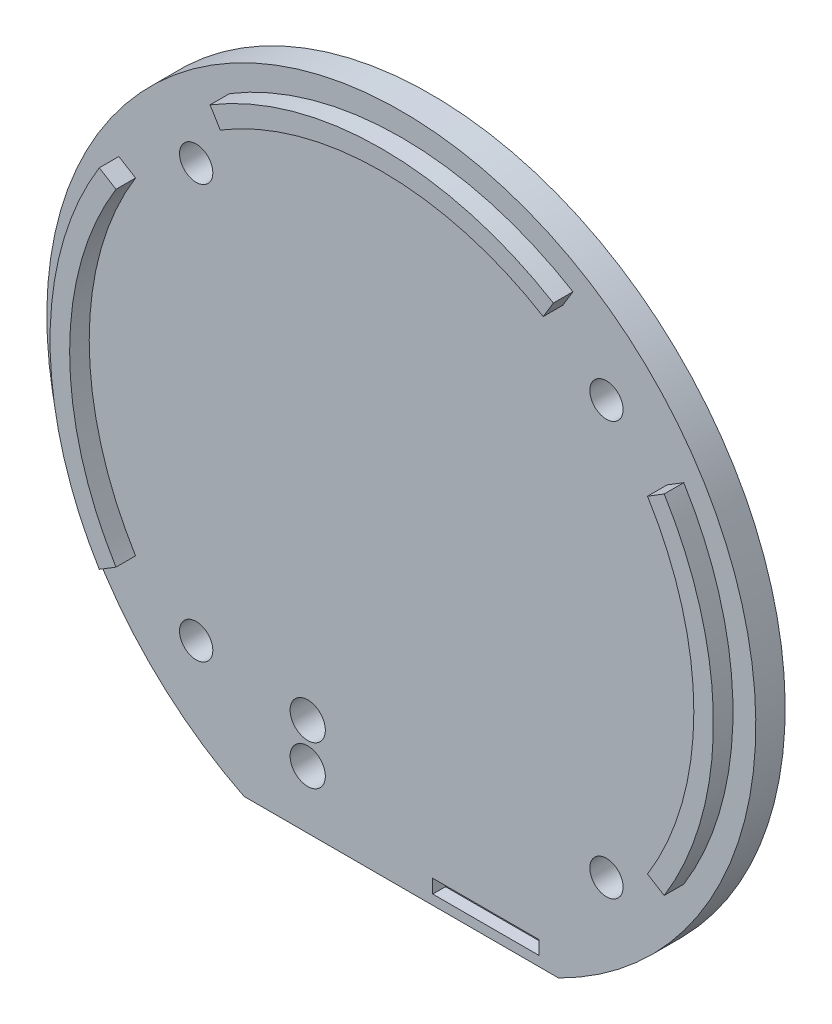
ISO-10303-21;
HEADER;
FILE_DESCRIPTION(('STEP AP214'),'2;1');
FILE_NAME('part.step','',(''),(''),'','','');
FILE_SCHEMA(('AUTOMOTIVE_DESIGN { 1 0 10303 214 1 1 1 1 }'));
ENDSEC;
DATA;
#1=APPLICATION_CONTEXT('core data for automotive mechanical design processes');
#2=APPLICATION_PROTOCOL_DEFINITION('international standard','automotive_design',2000,#1);
#3=PRODUCT_CONTEXT('',#1,'mechanical');
#4=PRODUCT('Part','Part','',(#3));
#5=PRODUCT_RELATED_PRODUCT_CATEGORY('part','',(#4));
#6=PRODUCT_DEFINITION_FORMATION('','',#4);
#7=PRODUCT_DEFINITION_CONTEXT('part definition',#1,'design');
#8=PRODUCT_DEFINITION('design','',#6,#7);
#9=PRODUCT_DEFINITION_SHAPE('','',#8);
#10=(LENGTH_UNIT() NAMED_UNIT(*) SI_UNIT(.MILLI.,.METRE.));
#11=(NAMED_UNIT(*) PLANE_ANGLE_UNIT() SI_UNIT($,.RADIAN.));
#12=(NAMED_UNIT(*) SI_UNIT($,.STERADIAN.) SOLID_ANGLE_UNIT());
#13=UNCERTAINTY_MEASURE_WITH_UNIT(LENGTH_MEASURE(1.E-05),#10,'distance_accuracy_value','');
#14=(GEOMETRIC_REPRESENTATION_CONTEXT(3) GLOBAL_UNCERTAINTY_ASSIGNED_CONTEXT((#13)) GLOBAL_UNIT_ASSIGNED_CONTEXT((#10,
#11,#12)) REPRESENTATION_CONTEXT('',''));
#15=CARTESIAN_POINT('',(0.,0.,0.));
#16=DIRECTION('',(0.,0.,1.));
#17=DIRECTION('',(1.,0.,0.));
#18=AXIS2_PLACEMENT_3D('',#15,#16,#17);
#19=CARTESIAN_POINT('',(0.,0.,3.));
#20=DIRECTION('',(0.,0.,1.));
#21=DIRECTION('',(1.,0.,0.));
#22=AXIS2_PLACEMENT_3D('',#19,#20,#21);
#23=PLANE('',#22);
#24=DIRECTION('',(0.,-1.,0.));
#25=VECTOR('',#24,1.);
#26=CARTESIAN_POINT('',(3.20999999999999,-31.4536669730864,3.));
#27=LINE('',#26,#25);
#28=CARTESIAN_POINT('',(3.20999999999999,-30.0536669730864,3.));
#29=VERTEX_POINT('',#28);
#30=CARTESIAN_POINT('',(3.20999999999999,-31.4536669730864,3.));
#31=VERTEX_POINT('',#30);
#32=EDGE_CURVE('E48',#29,#31,#27,.T.);
#33=ORIENTED_EDGE('',*,*,#32,.F.);
#34=DIRECTION('',(-1.,0.,0.));
#35=VECTOR('',#34,1.);
#36=CARTESIAN_POINT('',(3.20999999999999,-30.0536669730864,3.));
#37=LINE('',#36,#35);
#38=CARTESIAN_POINT('',(14.06,-30.0536669730864,3.));
#39=VERTEX_POINT('',#38);
#40=EDGE_CURVE('E179',#39,#29,#37,.T.);
#41=ORIENTED_EDGE('',*,*,#40,.F.);
#42=DIRECTION('',(0.,1.,0.));
#43=VECTOR('',#42,1.);
#44=CARTESIAN_POINT('',(14.06,-31.4536669730864,3.));
#45=LINE('',#44,#43);
#46=CARTESIAN_POINT('',(14.06,-31.4536669730864,3.));
#47=VERTEX_POINT('',#46);
#48=EDGE_CURVE('E182',#47,#39,#45,.T.);
#49=ORIENTED_EDGE('',*,*,#48,.F.);
#50=DIRECTION('',(1.,0.,0.));
#51=VECTOR('',#50,1.);
#52=CARTESIAN_POINT('',(3.20999999999999,-31.4536669730864,3.));
#53=LINE('',#52,#51);
#54=EDGE_CURVE('E188',#31,#47,#53,.T.);
#55=ORIENTED_EDGE('',*,*,#54,.F.);
#56=EDGE_LOOP('',(#33,#41,#49,#55));
#57=FACE_BOUND('',#56,.T.);
#58=CARTESIAN_POINT('',(-9.56,-22.4536669730864,3.));
#59=DIRECTION('',(0.,0.,1.));
#60=DIRECTION('',(1.,0.,0.));
#61=AXIS2_PLACEMENT_3D('',#58,#59,#60);
#62=CIRCLE('',#61,1.8);
#63=CARTESIAN_POINT('',(-7.76,-22.4536669730864,3.));
#64=VERTEX_POINT('',#63);
#65=EDGE_CURVE('E201',#64,#64,#62,.F.);
#66=ORIENTED_EDGE('',*,*,#65,.T.);
#67=EDGE_LOOP('',(#66));
#68=FACE_BOUND('',#67,.T.);
#69=CARTESIAN_POINT('',(-9.56,-26.5236669730864,3.));
#70=DIRECTION('',(0.,0.,1.));
#71=DIRECTION('',(1.,0.,0.));
#72=AXIS2_PLACEMENT_3D('',#69,#70,#71);
#73=CIRCLE('',#72,1.8);
#74=CARTESIAN_POINT('',(-7.76,-26.5236669730864,3.));
#75=VERTEX_POINT('',#74);
#76=EDGE_CURVE('E202',#75,#75,#73,.F.);
#77=ORIENTED_EDGE('',*,*,#76,.T.);
#78=EDGE_LOOP('',(#77));
#79=FACE_BOUND('',#78,.T.);
#80=CARTESIAN_POINT('',(20.955,21.12,3.));
#81=DIRECTION('',(0.,0.,1.));
#82=DIRECTION('',(-1.,0.,0.));
#83=AXIS2_PLACEMENT_3D('',#80,#81,#82);
#84=CIRCLE('',#83,1.69999999999999);
#85=CARTESIAN_POINT('',(19.255,21.12,3.));
#86=VERTEX_POINT('',#85);
#87=EDGE_CURVE('E301',#86,#86,#84,.T.);
#88=ORIENTED_EDGE('',*,*,#87,.F.);
#89=EDGE_LOOP('',(#88));
#90=FACE_BOUND('',#89,.T.);
#91=CARTESIAN_POINT('',(-20.955,-21.12,3.));
#92=DIRECTION('',(0.,0.,1.));
#93=DIRECTION('',(1.,0.,0.));
#94=AXIS2_PLACEMENT_3D('',#91,#92,#93);
#95=CIRCLE('',#94,1.7);
#96=CARTESIAN_POINT('',(-19.255,-21.12,3.));
#97=VERTEX_POINT('',#96);
#98=EDGE_CURVE('E300',#97,#97,#95,.T.);
#99=ORIENTED_EDGE('',*,*,#98,.F.);
#100=EDGE_LOOP('',(#99));
#101=FACE_BOUND('',#100,.T.);
#102=CARTESIAN_POINT('',(20.955,-21.12,3.));
#103=DIRECTION('',(0.,0.,1.));
#104=DIRECTION('',(-1.,0.,0.));
#105=AXIS2_PLACEMENT_3D('',#102,#103,#104);
#106=CIRCLE('',#105,1.7);
#107=CARTESIAN_POINT('',(19.255,-21.12,3.));
#108=VERTEX_POINT('',#107);
#109=EDGE_CURVE('E294',#108,#108,#106,.T.);
#110=ORIENTED_EDGE('',*,*,#109,.F.);
#111=EDGE_LOOP('',(#110));
#112=FACE_BOUND('',#111,.T.);
#113=CARTESIAN_POINT('',(-20.955,21.12,3.));
#114=DIRECTION('',(0.,0.,1.));
#115=DIRECTION('',(1.,0.,0.));
#116=AXIS2_PLACEMENT_3D('',#113,#114,#115);
#117=CIRCLE('',#116,1.7);
#118=CARTESIAN_POINT('',(-19.255,21.12,3.));
#119=VERTEX_POINT('',#118);
#120=EDGE_CURVE('E308',#119,#119,#117,.T.);
#121=ORIENTED_EDGE('',*,*,#120,.F.);
#122=EDGE_LOOP('',(#121));
#123=FACE_BOUND('',#122,.T.);
#124=CARTESIAN_POINT('',(0.,0.,3.));
#125=DIRECTION('',(0.,0.,1.));
#126=DIRECTION('',(1.,0.,0.));
#127=AXIS2_PLACEMENT_3D('',#124,#125,#126);
#128=CIRCLE('',#127,36.21);
#129=CARTESIAN_POINT('',(16.06,-32.4536669730864,3.));
#130=VERTEX_POINT('',#129);
#131=CARTESIAN_POINT('',(-16.06,-32.4536669730864,3.));
#132=VERTEX_POINT('',#131);
#133=EDGE_CURVE('E319',#130,#132,#128,.T.);
#134=ORIENTED_EDGE('',*,*,#133,.T.);
#135=DIRECTION('',(1.,0.,0.));
#136=VECTOR('',#135,1.);
#137=CARTESIAN_POINT('',(-16.06,-32.4536669730864,3.));
#138=LINE('',#137,#136);
#139=EDGE_CURVE('E322',#132,#130,#138,.T.);
#140=ORIENTED_EDGE('',*,*,#139,.T.);
#141=EDGE_LOOP('',(#134,#140));
#142=FACE_BOUND('',#141,.T.);
#143=DIRECTION('',(0.851575618923762,0.52423178581102,0.));
#144=VECTOR('',#143,1.);
#145=CARTESIAN_POINT('',(-28.8513819691372,-17.7609729032773,3.));
#146=LINE('',#145,#144);
#147=CARTESIAN_POINT('',(-28.8513819691372,-17.7609729032773,3.));
#148=VERTEX_POINT('',#147);
#149=CARTESIAN_POINT('',(-27.1482307312897,-16.7125093316553,3.));
#150=VERTEX_POINT('',#149);
#151=EDGE_CURVE('E279',#148,#150,#146,.T.);
#152=ORIENTED_EDGE('',*,*,#151,.F.);
#153=CARTESIAN_POINT('',(0.,0.,3.));
#154=DIRECTION('',(0.,0.,1.));
#155=DIRECTION('',(1.,0.,0.));
#156=AXIS2_PLACEMENT_3D('',#153,#154,#155);
#157=CIRCLE('',#156,33.8800000000001);
#158=CARTESIAN_POINT('',(-28.8513819691372,17.7609729032773,3.));
#159=VERTEX_POINT('',#158);
#160=EDGE_CURVE('E265',#159,#148,#157,.T.);
#161=ORIENTED_EDGE('',*,*,#160,.F.);
#162=DIRECTION('',(-0.851575618923764,0.524231785811017,0.));
#163=VECTOR('',#162,1.);
#164=CARTESIAN_POINT('',(-28.8513819691372,17.7609729032773,3.));
#165=LINE('',#164,#163);
#166=CARTESIAN_POINT('',(-27.1482307312897,16.7125093316552,3.));
#167=VERTEX_POINT('',#166);
#168=EDGE_CURVE('E270',#167,#159,#165,.T.);
#169=ORIENTED_EDGE('',*,*,#168,.F.);
#170=CARTESIAN_POINT('',(0.,0.,3.));
#171=DIRECTION('',(0.,0.,-1.));
#172=DIRECTION('',(1.,0.,0.));
#173=AXIS2_PLACEMENT_3D('',#170,#171,#172);
#174=CIRCLE('',#173,31.8800000000001);
#175=EDGE_CURVE('E281',#150,#167,#174,.T.);
#176=ORIENTED_EDGE('',*,*,#175,.F.);
#177=EDGE_LOOP('',(#152,#161,#169,#176));
#178=FACE_BOUND('',#177,.T.);
#179=DIRECTION('',(0.517536740302721,-0.855660985692835,0.));
#180=VECTOR('',#179,1.);
#181=CARTESIAN_POINT('',(-17.5341447614561,28.9897941952734,3.));
#182=LINE('',#181,#180);
#183=CARTESIAN_POINT('',(-17.5341447614561,28.9897941952734,3.));
#184=VERTEX_POINT('',#183);
#185=CARTESIAN_POINT('',(-16.4990712808507,27.2784722238877,3.));
#186=VERTEX_POINT('',#185);
#187=EDGE_CURVE('E250',#184,#186,#182,.T.);
#188=ORIENTED_EDGE('',*,*,#187,.F.);
#189=CARTESIAN_POINT('',(0.,0.,3.));
#190=DIRECTION('',(0.,0.,1.));
#191=DIRECTION('',(1.,0.,0.));
#192=AXIS2_PLACEMENT_3D('',#189,#190,#191);
#193=CIRCLE('',#192,33.8800000000001);
#194=CARTESIAN_POINT('',(17.5341447614561,28.9897941952734,3.));
#195=VERTEX_POINT('',#194);
#196=EDGE_CURVE('E236',#195,#184,#193,.T.);
#197=ORIENTED_EDGE('',*,*,#196,.F.);
#198=DIRECTION('',(0.517536740302719,0.855660985692836,0.));
#199=VECTOR('',#198,1.);
#200=CARTESIAN_POINT('',(17.5341447614561,28.9897941952734,3.));
#201=LINE('',#200,#199);
#202=CARTESIAN_POINT('',(16.4990712808508,27.2784722238877,3.));
#203=VERTEX_POINT('',#202);
#204=EDGE_CURVE('E241',#203,#195,#201,.T.);
#205=ORIENTED_EDGE('',*,*,#204,.F.);
#206=CARTESIAN_POINT('',(0.,0.,3.));
#207=DIRECTION('',(0.,0.,-1.));
#208=DIRECTION('',(1.,0.,0.));
#209=AXIS2_PLACEMENT_3D('',#206,#207,#208);
#210=CIRCLE('',#209,31.8800000000001);
#211=EDGE_CURVE('E252',#186,#203,#210,.T.);
#212=ORIENTED_EDGE('',*,*,#211,.F.);
#213=EDGE_LOOP('',(#188,#197,#205,#212));
#214=FACE_BOUND('',#213,.T.);
#215=DIRECTION('',(-0.851575618923764,-0.524231785811017,0.));
#216=VECTOR('',#215,1.);
#217=CARTESIAN_POINT('',(28.8513819691372,17.7609729032773,3.));
#218=LINE('',#217,#216);
#219=CARTESIAN_POINT('',(28.8513819691372,17.7609729032773,3.));
#220=VERTEX_POINT('',#219);
#221=CARTESIAN_POINT('',(27.1482307312896,16.7125093316553,3.));
#222=VERTEX_POINT('',#221);
#223=EDGE_CURVE('E223',#220,#222,#218,.T.);
#224=ORIENTED_EDGE('',*,*,#223,.F.);
#225=CARTESIAN_POINT('',(0.,0.,3.));
#226=DIRECTION('',(0.,0.,1.));
#227=DIRECTION('',(-1.,0.,0.));
#228=AXIS2_PLACEMENT_3D('',#225,#226,#227);
#229=CIRCLE('',#228,33.8800000000001);
#230=CARTESIAN_POINT('',(28.8513819691372,-17.7609729032773,3.));
#231=VERTEX_POINT('',#230);
#232=EDGE_CURVE('E205',#231,#220,#229,.T.);
#233=ORIENTED_EDGE('',*,*,#232,.F.);
#234=DIRECTION('',(0.851575618923764,-0.524231785811017,0.));
#235=VECTOR('',#234,1.);
#236=CARTESIAN_POINT('',(28.8513819691372,-17.7609729032773,3.));
#237=LINE('',#236,#235);
#238=CARTESIAN_POINT('',(27.1482307312897,-16.7125093316553,3.));
#239=VERTEX_POINT('',#238);
#240=EDGE_CURVE('E214',#239,#231,#237,.T.);
#241=ORIENTED_EDGE('',*,*,#240,.F.);
#242=CARTESIAN_POINT('',(0.,0.,3.));
#243=DIRECTION('',(0.,0.,-1.));
#244=DIRECTION('',(-1.,0.,0.));
#245=AXIS2_PLACEMENT_3D('',#242,#243,#244);
#246=CIRCLE('',#245,31.8800000000001);
#247=EDGE_CURVE('E225',#222,#239,#246,.T.);
#248=ORIENTED_EDGE('',*,*,#247,.F.);
#249=EDGE_LOOP('',(#224,#233,#241,#248));
#250=FACE_BOUND('',#249,.T.);
#251=ADVANCED_FACE('F33',(#57,#68,#79,#90,#101,#112,#123,#142,#178,#214,#250),#23,.T.);
#252=CARTESIAN_POINT('',(0.,0.,3.));
#253=DIRECTION('',(0.,0.,-1.));
#254=DIRECTION('',(-1.,0.,0.));
#255=AXIS2_PLACEMENT_3D('',#252,#253,#254);
#256=CYLINDRICAL_SURFACE('',#255,36.21);
#257=CARTESIAN_POINT('',(0.,0.,0.));
#258=DIRECTION('',(0.,0.,1.));
#259=DIRECTION('',(1.,0.,0.));
#260=AXIS2_PLACEMENT_3D('',#257,#258,#259);
#261=CIRCLE('',#260,36.21);
#262=CARTESIAN_POINT('',(16.06,-32.4536669730864,0.));
#263=VERTEX_POINT('',#262);
#264=CARTESIAN_POINT('',(-16.06,-32.4536669730864,0.));
#265=VERTEX_POINT('',#264);
#266=EDGE_CURVE('E318',#263,#265,#261,.T.);
#267=ORIENTED_EDGE('',*,*,#266,.T.);
#268=DIRECTION('',(0.,0.,-1.));
#269=VECTOR('',#268,1.);
#270=CARTESIAN_POINT('',(-16.06,-32.4536669730864,3.));
#271=LINE('',#270,#269);
#272=EDGE_CURVE('E11',#132,#265,#271,.T.);
#273=ORIENTED_EDGE('',*,*,#272,.F.);
#274=ORIENTED_EDGE('',*,*,#133,.F.);
#275=DIRECTION('',(0.,0.,-1.));
#276=VECTOR('',#275,1.);
#277=CARTESIAN_POINT('',(16.06,-32.4536669730864,3.));
#278=LINE('',#277,#276);
#279=EDGE_CURVE('E41',#130,#263,#278,.T.);
#280=ORIENTED_EDGE('',*,*,#279,.T.);
#281=EDGE_LOOP('',(#267,#273,#274,#280));
#282=FACE_BOUND('',#281,.T.);
#283=ADVANCED_FACE('F35',(#282),#256,.T.);
#284=CARTESIAN_POINT('',(-16.06,-32.4536669730864,3.));
#285=DIRECTION('',(0.,1.,0.));
#286=DIRECTION('',(0.,0.,1.));
#287=AXIS2_PLACEMENT_3D('',#284,#285,#286);
#288=PLANE('',#287);
#289=DIRECTION('',(1.,0.,0.));
#290=VECTOR('',#289,1.);
#291=CARTESIAN_POINT('',(-16.06,-32.4536669730864,0.));
#292=LINE('',#291,#290);
#293=EDGE_CURVE('E323',#265,#263,#292,.T.);
#294=ORIENTED_EDGE('',*,*,#293,.T.);
#295=ORIENTED_EDGE('',*,*,#279,.F.);
#296=ORIENTED_EDGE('',*,*,#139,.F.);
#297=ORIENTED_EDGE('',*,*,#272,.T.);
#298=EDGE_LOOP('',(#294,#295,#296,#297));
#299=FACE_BOUND('',#298,.T.);
#300=ADVANCED_FACE('F336',(#299),#288,.F.);
#301=CARTESIAN_POINT('',(0.,0.,0.));
#302=DIRECTION('',(0.,0.,1.));
#303=DIRECTION('',(1.,0.,0.));
#304=AXIS2_PLACEMENT_3D('',#301,#302,#303);
#305=PLANE('',#304);
#306=CARTESIAN_POINT('',(-9.56,-22.4536669730864,0.));
#307=DIRECTION('',(0.,0.,-1.));
#308=DIRECTION('',(-1.,0.,0.));
#309=AXIS2_PLACEMENT_3D('',#306,#307,#308);
#310=CIRCLE('',#309,1.8);
#311=CARTESIAN_POINT('',(-11.36,-22.4536669730864,0.));
#312=VERTEX_POINT('',#311);
#313=EDGE_CURVE('E198',#312,#312,#310,.T.);
#314=ORIENTED_EDGE('',*,*,#313,.F.);
#315=EDGE_LOOP('',(#314));
#316=FACE_BOUND('',#315,.T.);
#317=CARTESIAN_POINT('',(-9.56,-26.5236669730864,0.));
#318=DIRECTION('',(0.,0.,-1.));
#319=DIRECTION('',(-1.,0.,0.));
#320=AXIS2_PLACEMENT_3D('',#317,#318,#319);
#321=CIRCLE('',#320,1.8);
#322=CARTESIAN_POINT('',(-11.36,-26.5236669730864,0.));
#323=VERTEX_POINT('',#322);
#324=EDGE_CURVE('E194',#323,#323,#321,.T.);
#325=ORIENTED_EDGE('',*,*,#324,.F.);
#326=EDGE_LOOP('',(#325));
#327=FACE_BOUND('',#326,.T.);
#328=CARTESIAN_POINT('',(20.955,21.12,0.));
#329=DIRECTION('',(0.,0.,1.));
#330=DIRECTION('',(1.,0.,0.));
#331=AXIS2_PLACEMENT_3D('',#328,#329,#330);
#332=CIRCLE('',#331,1.69999999999999);
#333=CARTESIAN_POINT('',(22.655,21.12,0.));
#334=VERTEX_POINT('',#333);
#335=EDGE_CURVE('E304',#334,#334,#332,.F.);
#336=ORIENTED_EDGE('',*,*,#335,.F.);
#337=EDGE_LOOP('',(#336));
#338=FACE_BOUND('',#337,.T.);
#339=CARTESIAN_POINT('',(-20.955,-21.12,0.));
#340=DIRECTION('',(0.,0.,1.));
#341=DIRECTION('',(1.,0.,0.));
#342=AXIS2_PLACEMENT_3D('',#339,#340,#341);
#343=CIRCLE('',#342,1.7);
#344=CARTESIAN_POINT('',(-19.255,-21.12,0.));
#345=VERTEX_POINT('',#344);
#346=EDGE_CURVE('E305',#345,#345,#343,.F.);
#347=ORIENTED_EDGE('',*,*,#346,.F.);
#348=EDGE_LOOP('',(#347));
#349=FACE_BOUND('',#348,.T.);
#350=CARTESIAN_POINT('',(20.955,-21.12,0.));
#351=DIRECTION('',(0.,0.,1.));
#352=DIRECTION('',(1.,0.,0.));
#353=AXIS2_PLACEMENT_3D('',#350,#351,#352);
#354=CIRCLE('',#353,1.7);
#355=CARTESIAN_POINT('',(22.655,-21.12,0.));
#356=VERTEX_POINT('',#355);
#357=EDGE_CURVE('E297',#356,#356,#354,.F.);
#358=ORIENTED_EDGE('',*,*,#357,.F.);
#359=EDGE_LOOP('',(#358));
#360=FACE_BOUND('',#359,.T.);
#361=CARTESIAN_POINT('',(-20.955,21.12,0.));
#362=DIRECTION('',(0.,0.,1.));
#363=DIRECTION('',(1.,0.,0.));
#364=AXIS2_PLACEMENT_3D('',#361,#362,#363);
#365=CIRCLE('',#364,1.7);
#366=CARTESIAN_POINT('',(-19.255,21.12,0.));
#367=VERTEX_POINT('',#366);
#368=EDGE_CURVE('E315',#367,#367,#365,.F.);
#369=ORIENTED_EDGE('',*,*,#368,.F.);
#370=EDGE_LOOP('',(#369));
#371=FACE_BOUND('',#370,.T.);
#372=ORIENTED_EDGE('',*,*,#266,.F.);
#373=ORIENTED_EDGE('',*,*,#293,.F.);
#374=EDGE_LOOP('',(#372,#373));
#375=FACE_BOUND('',#374,.T.);
#376=ADVANCED_FACE('F335',(#316,#327,#338,#349,#360,#371,#375),#305,.F.);
#377=CARTESIAN_POINT('',(-20.955,21.12,-4.80832611206852));
#378=DIRECTION('',(0.,0.,1.));
#379=DIRECTION('',(1.,0.,0.));
#380=AXIS2_PLACEMENT_3D('',#377,#378,#379);
#381=CYLINDRICAL_SURFACE('',#380,1.7);
#382=ORIENTED_EDGE('',*,*,#368,.T.);
#383=EDGE_LOOP('',(#382));
#384=FACE_BOUND('',#383,.T.);
#385=ORIENTED_EDGE('',*,*,#120,.T.);
#386=EDGE_LOOP('',(#385));
#387=FACE_BOUND('',#386,.T.);
#388=ADVANCED_FACE('F428',(#384,#387),#381,.F.);
#389=CARTESIAN_POINT('',(20.955,-21.12,-4.80832611206852));
#390=DIRECTION('',(0.,0.,1.));
#391=DIRECTION('',(1.,0.,0.));
#392=AXIS2_PLACEMENT_3D('',#389,#390,#391);
#393=CYLINDRICAL_SURFACE('',#392,1.7);
#394=ORIENTED_EDGE('',*,*,#357,.T.);
#395=EDGE_LOOP('',(#394));
#396=FACE_BOUND('',#395,.T.);
#397=ORIENTED_EDGE('',*,*,#109,.T.);
#398=EDGE_LOOP('',(#397));
#399=FACE_BOUND('',#398,.T.);
#400=ADVANCED_FACE('F424',(#396,#399),#393,.F.);
#401=CARTESIAN_POINT('',(-20.955,-21.12,-4.80832611206852));
#402=DIRECTION('',(0.,0.,1.));
#403=DIRECTION('',(1.,0.,0.));
#404=AXIS2_PLACEMENT_3D('',#401,#402,#403);
#405=CYLINDRICAL_SURFACE('',#404,1.7);
#406=ORIENTED_EDGE('',*,*,#346,.T.);
#407=EDGE_LOOP('',(#406));
#408=FACE_BOUND('',#407,.T.);
#409=ORIENTED_EDGE('',*,*,#98,.T.);
#410=EDGE_LOOP('',(#409));
#411=FACE_BOUND('',#410,.T.);
#412=ADVANCED_FACE('F427',(#408,#411),#405,.F.);
#413=CARTESIAN_POINT('',(20.955,21.12,-4.80832611206852));
#414=DIRECTION('',(0.,0.,1.));
#415=DIRECTION('',(1.,0.,0.));
#416=AXIS2_PLACEMENT_3D('',#413,#414,#415);
#417=CYLINDRICAL_SURFACE('',#416,1.69999999999999);
#418=ORIENTED_EDGE('',*,*,#335,.T.);
#419=EDGE_LOOP('',(#418));
#420=FACE_BOUND('',#419,.T.);
#421=ORIENTED_EDGE('',*,*,#87,.T.);
#422=EDGE_LOOP('',(#421));
#423=FACE_BOUND('',#422,.T.);
#424=ADVANCED_FACE('F422',(#420,#423),#417,.F.);
#425=CARTESIAN_POINT('',(0.,0.,5.));
#426=DIRECTION('',(0.,0.,-1.));
#427=DIRECTION('',(-1.,0.,0.));
#428=AXIS2_PLACEMENT_3D('',#425,#426,#427);
#429=CYLINDRICAL_SURFACE('',#428,33.8800000000001);
#430=ORIENTED_EDGE('',*,*,#160,.T.);
#431=DIRECTION('',(0.,0.,-1.));
#432=VECTOR('',#431,1.);
#433=CARTESIAN_POINT('',(-28.8513819691372,-17.7609729032773,5.));
#434=LINE('',#433,#432);
#435=CARTESIAN_POINT('',(-28.8513819691372,-17.7609729032773,5.));
#436=VERTEX_POINT('',#435);
#437=EDGE_CURVE('E292',#436,#148,#434,.T.);
#438=ORIENTED_EDGE('',*,*,#437,.F.);
#439=CARTESIAN_POINT('',(0.,0.,5.));
#440=DIRECTION('',(0.,0.,1.));
#441=DIRECTION('',(1.,0.,0.));
#442=AXIS2_PLACEMENT_3D('',#439,#440,#441);
#443=CIRCLE('',#442,33.8800000000001);
#444=CARTESIAN_POINT('',(-28.8513819691372,17.7609729032773,5.));
#445=VERTEX_POINT('',#444);
#446=EDGE_CURVE('E266',#445,#436,#443,.T.);
#447=ORIENTED_EDGE('',*,*,#446,.F.);
#448=DIRECTION('',(0.,0.,-1.));
#449=VECTOR('',#448,1.);
#450=CARTESIAN_POINT('',(-28.8513819691372,17.7609729032773,5.));
#451=LINE('',#450,#449);
#452=EDGE_CURVE('E276',#445,#159,#451,.T.);
#453=ORIENTED_EDGE('',*,*,#452,.T.);
#454=EDGE_LOOP('',(#430,#438,#447,#453));
#455=FACE_BOUND('',#454,.T.);
#456=ADVANCED_FACE('F418',(#455),#429,.T.);
#457=CARTESIAN_POINT('',(-28.8513819691372,-17.7609729032773,5.));
#458=DIRECTION('',(-0.52423178581102,0.851575618923762,0.));
#459=DIRECTION('',(-0.851575618923762,-0.52423178581102,0.));
#460=AXIS2_PLACEMENT_3D('',#457,#458,#459);
#461=PLANE('',#460);
#462=ORIENTED_EDGE('',*,*,#151,.T.);
#463=DIRECTION('',(0.,0.,-1.));
#464=VECTOR('',#463,1.);
#465=CARTESIAN_POINT('',(-27.1482307312897,-16.7125093316553,5.));
#466=LINE('',#465,#464);
#467=CARTESIAN_POINT('',(-27.1482307312897,-16.7125093316553,5.));
#468=VERTEX_POINT('',#467);
#469=EDGE_CURVE('E289',#468,#150,#466,.T.);
#470=ORIENTED_EDGE('',*,*,#469,.F.);
#471=DIRECTION('',(0.851575618923762,0.52423178581102,0.));
#472=VECTOR('',#471,1.);
#473=CARTESIAN_POINT('',(-28.8513819691372,-17.7609729032773,5.));
#474=LINE('',#473,#472);
#475=EDGE_CURVE('E269',#436,#468,#474,.T.);
#476=ORIENTED_EDGE('',*,*,#475,.F.);
#477=ORIENTED_EDGE('',*,*,#437,.T.);
#478=EDGE_LOOP('',(#462,#470,#476,#477));
#479=FACE_BOUND('',#478,.T.);
#480=ADVANCED_FACE('F414',(#479),#461,.F.);
#481=CARTESIAN_POINT('',(0.,0.,5.));
#482=DIRECTION('',(0.,0.,-1.));
#483=DIRECTION('',(-1.,0.,0.));
#484=AXIS2_PLACEMENT_3D('',#481,#482,#483);
#485=CYLINDRICAL_SURFACE('',#484,31.8800000000001);
#486=ORIENTED_EDGE('',*,*,#175,.T.);
#487=DIRECTION('',(0.,0.,-1.));
#488=VECTOR('',#487,1.);
#489=CARTESIAN_POINT('',(-27.1482307312897,16.7125093316553,5.));
#490=LINE('',#489,#488);
#491=CARTESIAN_POINT('',(-27.1482307312897,16.7125093316553,5.));
#492=VERTEX_POINT('',#491);
#493=EDGE_CURVE('E287',#492,#167,#490,.T.);
#494=ORIENTED_EDGE('',*,*,#493,.F.);
#495=CARTESIAN_POINT('',(0.,0.,5.));
#496=DIRECTION('',(0.,0.,-1.));
#497=DIRECTION('',(1.,0.,0.));
#498=AXIS2_PLACEMENT_3D('',#495,#496,#497);
#499=CIRCLE('',#498,31.8800000000001);
#500=EDGE_CURVE('E272',#468,#492,#499,.T.);
#501=ORIENTED_EDGE('',*,*,#500,.F.);
#502=ORIENTED_EDGE('',*,*,#469,.T.);
#503=EDGE_LOOP('',(#486,#494,#501,#502));
#504=FACE_BOUND('',#503,.T.);
#505=ADVANCED_FACE('F410',(#504),#485,.F.);
#506=CARTESIAN_POINT('',(-28.8513819691372,17.7609729032773,5.));
#507=DIRECTION('',(-0.524231785811017,-0.851575618923764,0.));
#508=DIRECTION('',(0.851575618923765,-0.524231785811017,0.));
#509=AXIS2_PLACEMENT_3D('',#506,#507,#508);
#510=PLANE('',#509);
#511=ORIENTED_EDGE('',*,*,#168,.T.);
#512=ORIENTED_EDGE('',*,*,#452,.F.);
#513=DIRECTION('',(-0.851575618923764,0.524231785811017,0.));
#514=VECTOR('',#513,1.);
#515=CARTESIAN_POINT('',(-28.8513819691372,17.7609729032773,5.));
#516=LINE('',#515,#514);
#517=EDGE_CURVE('E274',#492,#445,#516,.T.);
#518=ORIENTED_EDGE('',*,*,#517,.F.);
#519=ORIENTED_EDGE('',*,*,#493,.T.);
#520=EDGE_LOOP('',(#511,#512,#518,#519));
#521=FACE_BOUND('',#520,.T.);
#522=ADVANCED_FACE('F406',(#521),#510,.F.);
#523=CARTESIAN_POINT('',(0.,0.,5.));
#524=DIRECTION('',(0.,0.,1.));
#525=DIRECTION('',(1.,0.,0.));
#526=AXIS2_PLACEMENT_3D('',#523,#524,#525);
#527=PLANE('',#526);
#528=ORIENTED_EDGE('',*,*,#446,.T.);
#529=ORIENTED_EDGE('',*,*,#475,.T.);
#530=ORIENTED_EDGE('',*,*,#500,.T.);
#531=ORIENTED_EDGE('',*,*,#517,.T.);
#532=EDGE_LOOP('',(#528,#529,#530,#531));
#533=FACE_BOUND('',#532,.T.);
#534=ADVANCED_FACE('F402',(#533),#527,.T.);
#535=CARTESIAN_POINT('',(0.,0.,5.));
#536=DIRECTION('',(0.,0.,-1.));
#537=DIRECTION('',(-1.,0.,0.));
#538=AXIS2_PLACEMENT_3D('',#535,#536,#537);
#539=CYLINDRICAL_SURFACE('',#538,33.8800000000001);
#540=ORIENTED_EDGE('',*,*,#196,.T.);
#541=DIRECTION('',(0.,0.,-1.));
#542=VECTOR('',#541,1.);
#543=CARTESIAN_POINT('',(-17.5341447614561,28.9897941952734,5.));
#544=LINE('',#543,#542);
#545=CARTESIAN_POINT('',(-17.5341447614561,28.9897941952734,5.));
#546=VERTEX_POINT('',#545);
#547=EDGE_CURVE('E263',#546,#184,#544,.T.);
#548=ORIENTED_EDGE('',*,*,#547,.F.);
#549=CARTESIAN_POINT('',(0.,0.,5.));
#550=DIRECTION('',(0.,0.,1.));
#551=DIRECTION('',(1.,0.,0.));
#552=AXIS2_PLACEMENT_3D('',#549,#550,#551);
#553=CIRCLE('',#552,33.8800000000001);
#554=CARTESIAN_POINT('',(17.5341447614561,28.9897941952734,5.));
#555=VERTEX_POINT('',#554);
#556=EDGE_CURVE('E237',#555,#546,#553,.T.);
#557=ORIENTED_EDGE('',*,*,#556,.F.);
#558=DIRECTION('',(0.,0.,-1.));
#559=VECTOR('',#558,1.);
#560=CARTESIAN_POINT('',(17.5341447614561,28.9897941952734,5.));
#561=LINE('',#560,#559);
#562=EDGE_CURVE('E247',#555,#195,#561,.T.);
#563=ORIENTED_EDGE('',*,*,#562,.T.);
#564=EDGE_LOOP('',(#540,#548,#557,#563));
#565=FACE_BOUND('',#564,.T.);
#566=ADVANCED_FACE('F398',(#565),#539,.T.);
#567=CARTESIAN_POINT('',(-17.5341447614561,28.9897941952734,5.));
#568=DIRECTION('',(0.855660985692835,0.517536740302721,0.));
#569=DIRECTION('',(-0.517536740302721,0.855660985692835,0.));
#570=AXIS2_PLACEMENT_3D('',#567,#568,#569);
#571=PLANE('',#570);
#572=ORIENTED_EDGE('',*,*,#187,.T.);
#573=DIRECTION('',(0.,0.,-1.));
#574=VECTOR('',#573,1.);
#575=CARTESIAN_POINT('',(-16.4990712808507,27.2784722238877,5.));
#576=LINE('',#575,#574);
#577=CARTESIAN_POINT('',(-16.4990712808507,27.2784722238877,5.));
#578=VERTEX_POINT('',#577);
#579=EDGE_CURVE('E260',#578,#186,#576,.T.);
#580=ORIENTED_EDGE('',*,*,#579,.F.);
#581=DIRECTION('',(0.517536740302721,-0.855660985692835,0.));
#582=VECTOR('',#581,1.);
#583=CARTESIAN_POINT('',(-17.5341447614561,28.9897941952734,5.));
#584=LINE('',#583,#582);
#585=EDGE_CURVE('E240',#546,#578,#584,.T.);
#586=ORIENTED_EDGE('',*,*,#585,.F.);
#587=ORIENTED_EDGE('',*,*,#547,.T.);
#588=EDGE_LOOP('',(#572,#580,#586,#587));
#589=FACE_BOUND('',#588,.T.);
#590=ADVANCED_FACE('F394',(#589),#571,.F.);
#591=CARTESIAN_POINT('',(0.,0.,5.));
#592=DIRECTION('',(0.,0.,-1.));
#593=DIRECTION('',(-1.,0.,0.));
#594=AXIS2_PLACEMENT_3D('',#591,#592,#593);
#595=CYLINDRICAL_SURFACE('',#594,31.8800000000001);
#596=ORIENTED_EDGE('',*,*,#211,.T.);
#597=DIRECTION('',(0.,0.,-1.));
#598=VECTOR('',#597,1.);
#599=CARTESIAN_POINT('',(16.4990712808507,27.2784722238877,5.));
#600=LINE('',#599,#598);
#601=CARTESIAN_POINT('',(16.4990712808507,27.2784722238877,5.));
#602=VERTEX_POINT('',#601);
#603=EDGE_CURVE('E258',#602,#203,#600,.T.);
#604=ORIENTED_EDGE('',*,*,#603,.F.);
#605=CARTESIAN_POINT('',(0.,0.,5.));
#606=DIRECTION('',(0.,0.,-1.));
#607=DIRECTION('',(1.,0.,0.));
#608=AXIS2_PLACEMENT_3D('',#605,#606,#607);
#609=CIRCLE('',#608,31.8800000000001);
#610=EDGE_CURVE('E243',#578,#602,#609,.T.);
#611=ORIENTED_EDGE('',*,*,#610,.F.);
#612=ORIENTED_EDGE('',*,*,#579,.T.);
#613=EDGE_LOOP('',(#596,#604,#611,#612));
#614=FACE_BOUND('',#613,.T.);
#615=ADVANCED_FACE('F390',(#614),#595,.F.);
#616=CARTESIAN_POINT('',(17.5341447614561,28.9897941952734,5.));
#617=DIRECTION('',(-0.855660985692836,0.517536740302719,0.));
#618=DIRECTION('',(-0.517536740302719,-0.855660985692836,0.));
#619=AXIS2_PLACEMENT_3D('',#616,#617,#618);
#620=PLANE('',#619);
#621=ORIENTED_EDGE('',*,*,#204,.T.);
#622=ORIENTED_EDGE('',*,*,#562,.F.);
#623=DIRECTION('',(0.517536740302719,0.855660985692836,0.));
#624=VECTOR('',#623,1.);
#625=CARTESIAN_POINT('',(17.5341447614561,28.9897941952734,5.));
#626=LINE('',#625,#624);
#627=EDGE_CURVE('E245',#602,#555,#626,.T.);
#628=ORIENTED_EDGE('',*,*,#627,.F.);
#629=ORIENTED_EDGE('',*,*,#603,.T.);
#630=EDGE_LOOP('',(#621,#622,#628,#629));
#631=FACE_BOUND('',#630,.T.);
#632=ADVANCED_FACE('F386',(#631),#620,.F.);
#633=CARTESIAN_POINT('',(0.,0.,5.));
#634=DIRECTION('',(0.,0.,1.));
#635=DIRECTION('',(1.,0.,0.));
#636=AXIS2_PLACEMENT_3D('',#633,#634,#635);
#637=PLANE('',#636);
#638=ORIENTED_EDGE('',*,*,#556,.T.);
#639=ORIENTED_EDGE('',*,*,#585,.T.);
#640=ORIENTED_EDGE('',*,*,#610,.T.);
#641=ORIENTED_EDGE('',*,*,#627,.T.);
#642=EDGE_LOOP('',(#638,#639,#640,#641));
#643=FACE_BOUND('',#642,.T.);
#644=ADVANCED_FACE('F383',(#643),#637,.T.);
#645=CARTESIAN_POINT('',(0.,0.,5.));
#646=DIRECTION('',(0.,0.,-1.));
#647=DIRECTION('',(-1.,0.,0.));
#648=AXIS2_PLACEMENT_3D('',#645,#646,#647);
#649=CYLINDRICAL_SURFACE('',#648,33.8800000000001);
#650=ORIENTED_EDGE('',*,*,#232,.T.);
#651=DIRECTION('',(0.,0.,-1.));
#652=VECTOR('',#651,1.);
#653=CARTESIAN_POINT('',(28.8513819691372,17.7609729032773,5.));
#654=LINE('',#653,#652);
#655=CARTESIAN_POINT('',(28.8513819691372,17.7609729032773,5.));
#656=VERTEX_POINT('',#655);
#657=EDGE_CURVE('E234',#656,#220,#654,.T.);
#658=ORIENTED_EDGE('',*,*,#657,.F.);
#659=CARTESIAN_POINT('',(0.,0.,5.));
#660=DIRECTION('',(0.,0.,1.));
#661=DIRECTION('',(-1.,0.,0.));
#662=AXIS2_PLACEMENT_3D('',#659,#660,#661);
#663=CIRCLE('',#662,33.8800000000001);
#664=CARTESIAN_POINT('',(28.8513819691372,-17.7609729032773,5.));
#665=VERTEX_POINT('',#664);
#666=EDGE_CURVE('E210',#665,#656,#663,.T.);
#667=ORIENTED_EDGE('',*,*,#666,.F.);
#668=DIRECTION('',(0.,0.,-1.));
#669=VECTOR('',#668,1.);
#670=CARTESIAN_POINT('',(28.8513819691372,-17.7609729032773,5.));
#671=LINE('',#670,#669);
#672=EDGE_CURVE('E220',#665,#231,#671,.T.);
#673=ORIENTED_EDGE('',*,*,#672,.T.);
#674=EDGE_LOOP('',(#650,#658,#667,#673));
#675=FACE_BOUND('',#674,.T.);
#676=ADVANCED_FACE('F366',(#675),#649,.T.);
#677=CARTESIAN_POINT('',(28.8513819691372,17.7609729032773,5.));
#678=DIRECTION('',(0.524231785811017,-0.851575618923764,0.));
#679=DIRECTION('',(0.851575618923764,0.524231785811017,0.));
#680=AXIS2_PLACEMENT_3D('',#677,#678,#679);
#681=PLANE('',#680);
#682=ORIENTED_EDGE('',*,*,#223,.T.);
#683=DIRECTION('',(0.,0.,-1.));
#684=VECTOR('',#683,1.);
#685=CARTESIAN_POINT('',(27.1482307312896,16.7125093316553,5.));
#686=LINE('',#685,#684);
#687=CARTESIAN_POINT('',(27.1482307312896,16.7125093316553,5.));
#688=VERTEX_POINT('',#687);
#689=EDGE_CURVE('E231',#688,#222,#686,.T.);
#690=ORIENTED_EDGE('',*,*,#689,.F.);
#691=DIRECTION('',(-0.851575618923764,-0.524231785811017,0.));
#692=VECTOR('',#691,1.);
#693=CARTESIAN_POINT('',(28.8513819691372,17.7609729032773,5.));
#694=LINE('',#693,#692);
#695=EDGE_CURVE('E213',#656,#688,#694,.T.);
#696=ORIENTED_EDGE('',*,*,#695,.F.);
#697=ORIENTED_EDGE('',*,*,#657,.T.);
#698=EDGE_LOOP('',(#682,#690,#696,#697));
#699=FACE_BOUND('',#698,.T.);
#700=ADVANCED_FACE('F356',(#699),#681,.F.);
#701=CARTESIAN_POINT('',(0.,0.,5.));
#702=DIRECTION('',(0.,0.,-1.));
#703=DIRECTION('',(-1.,0.,0.));
#704=AXIS2_PLACEMENT_3D('',#701,#702,#703);
#705=CYLINDRICAL_SURFACE('',#704,31.8800000000001);
#706=ORIENTED_EDGE('',*,*,#247,.T.);
#707=DIRECTION('',(0.,0.,-1.));
#708=VECTOR('',#707,1.);
#709=CARTESIAN_POINT('',(27.1482307312897,-16.7125093316553,5.));
#710=LINE('',#709,#708);
#711=CARTESIAN_POINT('',(27.1482307312897,-16.7125093316553,5.));
#712=VERTEX_POINT('',#711);
#713=EDGE_CURVE('E56',#712,#239,#710,.T.);
#714=ORIENTED_EDGE('',*,*,#713,.F.);
#715=CARTESIAN_POINT('',(0.,0.,5.));
#716=DIRECTION('',(0.,0.,-1.));
#717=DIRECTION('',(-1.,0.,0.));
#718=AXIS2_PLACEMENT_3D('',#715,#716,#717);
#719=CIRCLE('',#718,31.8800000000001);
#720=EDGE_CURVE('E216',#688,#712,#719,.T.);
#721=ORIENTED_EDGE('',*,*,#720,.F.);
#722=ORIENTED_EDGE('',*,*,#689,.T.);
#723=EDGE_LOOP('',(#706,#714,#721,#722));
#724=FACE_BOUND('',#723,.T.);
#725=ADVANCED_FACE('F360',(#724),#705,.F.);
#726=CARTESIAN_POINT('',(28.8513819691372,-17.7609729032773,5.));
#727=DIRECTION('',(0.524231785811017,0.851575618923764,0.));
#728=DIRECTION('',(-0.851575618923764,0.524231785811017,0.));
#729=AXIS2_PLACEMENT_3D('',#726,#727,#728);
#730=PLANE('',#729);
#731=ORIENTED_EDGE('',*,*,#240,.T.);
#732=ORIENTED_EDGE('',*,*,#672,.F.);
#733=DIRECTION('',(0.851575618923764,-0.524231785811017,0.));
#734=VECTOR('',#733,1.);
#735=CARTESIAN_POINT('',(28.8513819691372,-17.7609729032773,5.));
#736=LINE('',#735,#734);
#737=EDGE_CURVE('E218',#712,#665,#736,.T.);
#738=ORIENTED_EDGE('',*,*,#737,.F.);
#739=ORIENTED_EDGE('',*,*,#713,.T.);
#740=EDGE_LOOP('',(#731,#732,#738,#739));
#741=FACE_BOUND('',#740,.T.);
#742=ADVANCED_FACE('F367',(#741),#730,.F.);
#743=CARTESIAN_POINT('',(0.,0.,5.));
#744=DIRECTION('',(0.,0.,-1.));
#745=DIRECTION('',(-1.,0.,0.));
#746=AXIS2_PLACEMENT_3D('',#743,#744,#745);
#747=PLANE('',#746);
#748=ORIENTED_EDGE('',*,*,#666,.T.);
#749=ORIENTED_EDGE('',*,*,#695,.T.);
#750=ORIENTED_EDGE('',*,*,#720,.T.);
#751=ORIENTED_EDGE('',*,*,#737,.T.);
#752=EDGE_LOOP('',(#748,#749,#750,#751));
#753=FACE_BOUND('',#752,.T.);
#754=ADVANCED_FACE('F362',(#753),#747,.F.);
#755=CARTESIAN_POINT('',(-9.56,-26.5236669730864,8.09116882454314));
#756=DIRECTION('',(0.,0.,-1.));
#757=DIRECTION('',(-1.,0.,0.));
#758=AXIS2_PLACEMENT_3D('',#755,#756,#757);
#759=CYLINDRICAL_SURFACE('',#758,1.8);
#760=ORIENTED_EDGE('',*,*,#324,.T.);
#761=EDGE_LOOP('',(#760));
#762=FACE_BOUND('',#761,.T.);
#763=ORIENTED_EDGE('',*,*,#76,.F.);
#764=EDGE_LOOP('',(#763));
#765=FACE_BOUND('',#764,.T.);
#766=ADVANCED_FACE('F374',(#762,#765),#759,.F.);
#767=CARTESIAN_POINT('',(-9.56,-22.4536669730864,8.09116882454314));
#768=DIRECTION('',(0.,0.,-1.));
#769=DIRECTION('',(-1.,0.,0.));
#770=AXIS2_PLACEMENT_3D('',#767,#768,#769);
#771=CYLINDRICAL_SURFACE('',#770,1.8);
#772=ORIENTED_EDGE('',*,*,#313,.T.);
#773=EDGE_LOOP('',(#772));
#774=FACE_BOUND('',#773,.T.);
#775=ORIENTED_EDGE('',*,*,#65,.F.);
#776=EDGE_LOOP('',(#775));
#777=FACE_BOUND('',#776,.T.);
#778=ADVANCED_FACE('F459',(#774,#777),#771,.F.);
#779=CARTESIAN_POINT('',(3.20999999999999,-31.4536669730864,1.7));
#780=DIRECTION('',(-1.,0.,0.));
#781=DIRECTION('',(0.,0.,1.));
#782=AXIS2_PLACEMENT_3D('',#779,#780,#781);
#783=PLANE('',#782);
#784=ORIENTED_EDGE('',*,*,#32,.T.);
#785=DIRECTION('',(0.,0.,1.));
#786=VECTOR('',#785,1.);
#787=CARTESIAN_POINT('',(3.20999999999999,-31.4536669730864,1.7));
#788=LINE('',#787,#786);
#789=CARTESIAN_POINT('',(3.20999999999999,-31.4536669730864,1.7));
#790=VERTEX_POINT('',#789);
#791=EDGE_CURVE('E157',#790,#31,#788,.T.);
#792=ORIENTED_EDGE('',*,*,#791,.F.);
#793=DIRECTION('',(0.,-1.,0.));
#794=VECTOR('',#793,1.);
#795=CARTESIAN_POINT('',(3.20999999999999,-31.4536669730864,1.7));
#796=LINE('',#795,#794);
#797=CARTESIAN_POINT('',(3.20999999999999,-30.0536669730864,1.7));
#798=VERTEX_POINT('',#797);
#799=EDGE_CURVE('E161',#798,#790,#796,.T.);
#800=ORIENTED_EDGE('',*,*,#799,.F.);
#801=DIRECTION('',(0.,0.,1.));
#802=VECTOR('',#801,1.);
#803=CARTESIAN_POINT('',(3.20999999999999,-30.0536669730864,1.7));
#804=LINE('',#803,#802);
#805=EDGE_CURVE('E192',#798,#29,#804,.T.);
#806=ORIENTED_EDGE('',*,*,#805,.T.);
#807=EDGE_LOOP('',(#784,#792,#800,#806));
#808=FACE_BOUND('',#807,.T.);
#809=ADVANCED_FACE('F159',(#808),#783,.F.);
#810=CARTESIAN_POINT('',(3.20999999999999,-30.0536669730864,1.7));
#811=DIRECTION('',(0.,1.,0.));
#812=DIRECTION('',(0.,0.,1.));
#813=AXIS2_PLACEMENT_3D('',#810,#811,#812);
#814=PLANE('',#813);
#815=ORIENTED_EDGE('',*,*,#40,.T.);
#816=ORIENTED_EDGE('',*,*,#805,.F.);
#817=DIRECTION('',(-1.,0.,0.));
#818=VECTOR('',#817,1.);
#819=CARTESIAN_POINT('',(3.20999999999999,-30.0536669730864,1.7));
#820=LINE('',#819,#818);
#821=CARTESIAN_POINT('',(14.06,-30.0536669730864,1.7));
#822=VERTEX_POINT('',#821);
#823=EDGE_CURVE('E167',#822,#798,#820,.T.);
#824=ORIENTED_EDGE('',*,*,#823,.F.);
#825=DIRECTION('',(0.,0.,1.));
#826=VECTOR('',#825,1.);
#827=CARTESIAN_POINT('',(14.06,-30.0536669730864,1.7));
#828=LINE('',#827,#826);
#829=EDGE_CURVE('E195',#822,#39,#828,.T.);
#830=ORIENTED_EDGE('',*,*,#829,.T.);
#831=EDGE_LOOP('',(#815,#816,#824,#830));
#832=FACE_BOUND('',#831,.T.);
#833=ADVANCED_FACE('F468',(#832),#814,.F.);
#834=CARTESIAN_POINT('',(14.06,-31.4536669730864,1.7));
#835=DIRECTION('',(1.,0.,0.));
#836=DIRECTION('',(0.,0.,-1.));
#837=AXIS2_PLACEMENT_3D('',#834,#835,#836);
#838=PLANE('',#837);
#839=ORIENTED_EDGE('',*,*,#48,.T.);
#840=ORIENTED_EDGE('',*,*,#829,.F.);
#841=DIRECTION('',(0.,1.,0.));
#842=VECTOR('',#841,1.);
#843=CARTESIAN_POINT('',(14.06,-31.4536669730864,1.7));
#844=LINE('',#843,#842);
#845=CARTESIAN_POINT('',(14.06,-31.4536669730864,1.7));
#846=VERTEX_POINT('',#845);
#847=EDGE_CURVE('E175',#846,#822,#844,.T.);
#848=ORIENTED_EDGE('',*,*,#847,.F.);
#849=DIRECTION('',(0.,0.,1.));
#850=VECTOR('',#849,1.);
#851=CARTESIAN_POINT('',(14.06,-31.4536669730864,1.7));
#852=LINE('',#851,#850);
#853=EDGE_CURVE('E166',#846,#47,#852,.T.);
#854=ORIENTED_EDGE('',*,*,#853,.T.);
#855=EDGE_LOOP('',(#839,#840,#848,#854));
#856=FACE_BOUND('',#855,.T.);
#857=ADVANCED_FACE('F477',(#856),#838,.F.);
#858=CARTESIAN_POINT('',(3.20999999999999,-31.4536669730864,1.7));
#859=DIRECTION('',(0.,-1.,0.));
#860=DIRECTION('',(0.,0.,-1.));
#861=AXIS2_PLACEMENT_3D('',#858,#859,#860);
#862=PLANE('',#861);
#863=ORIENTED_EDGE('',*,*,#54,.T.);
#864=ORIENTED_EDGE('',*,*,#853,.F.);
#865=DIRECTION('',(1.,0.,0.));
#866=VECTOR('',#865,1.);
#867=CARTESIAN_POINT('',(3.20999999999999,-31.4536669730864,1.7));
#868=LINE('',#867,#866);
#869=EDGE_CURVE('E170',#790,#846,#868,.T.);
#870=ORIENTED_EDGE('',*,*,#869,.F.);
#871=ORIENTED_EDGE('',*,*,#791,.T.);
#872=EDGE_LOOP('',(#863,#864,#870,#871));
#873=FACE_BOUND('',#872,.T.);
#874=ADVANCED_FACE('F171',(#873),#862,.F.);
#875=CARTESIAN_POINT('',(0.,0.,1.7));
#876=DIRECTION('',(0.,0.,-1.));
#877=DIRECTION('',(-1.,0.,0.));
#878=AXIS2_PLACEMENT_3D('',#875,#876,#877);
#879=PLANE('',#878);
#880=ORIENTED_EDGE('',*,*,#799,.T.);
#881=ORIENTED_EDGE('',*,*,#869,.T.);
#882=ORIENTED_EDGE('',*,*,#847,.T.);
#883=ORIENTED_EDGE('',*,*,#823,.T.);
#884=EDGE_LOOP('',(#880,#881,#882,#883));
#885=FACE_BOUND('',#884,.T.);
#886=ADVANCED_FACE('F177',(#885),#879,.F.);
#887=CLOSED_SHELL('',(#251,#283,#300,#376,#388,#400,#412,#424,#456,#480,#505,#522,#534,#566,
#590,#615,#632,#644,#676,#700,#725,#742,#754,#766,#778,#809,#833,#857,#874,#886));
#888=MANIFOLD_SOLID_BREP('B2',#887);
#889=ADVANCED_BREP_SHAPE_REPRESENTATION('',(#18,#888),#14);
#890=SHAPE_DEFINITION_REPRESENTATION(#9,#889);
ENDSEC;
END-ISO-10303-21;
